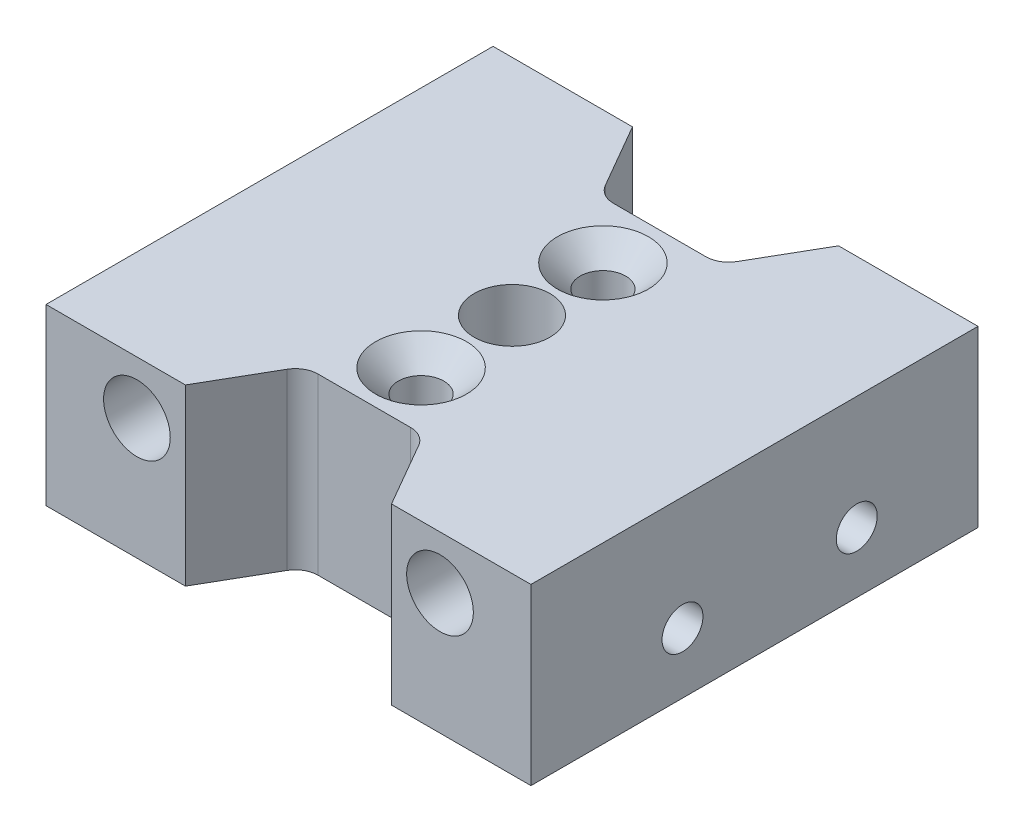
ISO-10303-21;
HEADER;
FILE_DESCRIPTION(('STEP AP214'),'2;1');
FILE_NAME('part.step','',(''),(''),'','','');
FILE_SCHEMA(('AUTOMOTIVE_DESIGN { 1 0 10303 214 1 1 1 1 }'));
ENDSEC;
DATA;
#1=APPLICATION_CONTEXT('core data for automotive mechanical design processes');
#2=APPLICATION_PROTOCOL_DEFINITION('international standard','automotive_design',2000,#1);
#3=PRODUCT_CONTEXT('',#1,'mechanical');
#4=PRODUCT('Part','Part','',(#3));
#5=PRODUCT_RELATED_PRODUCT_CATEGORY('part','',(#4));
#6=PRODUCT_DEFINITION_FORMATION('','',#4);
#7=PRODUCT_DEFINITION_CONTEXT('part definition',#1,'design');
#8=PRODUCT_DEFINITION('design','',#6,#7);
#9=PRODUCT_DEFINITION_SHAPE('','',#8);
#10=(LENGTH_UNIT() NAMED_UNIT(*) SI_UNIT(.MILLI.,.METRE.));
#11=(NAMED_UNIT(*) PLANE_ANGLE_UNIT() SI_UNIT($,.RADIAN.));
#12=(NAMED_UNIT(*) SI_UNIT($,.STERADIAN.) SOLID_ANGLE_UNIT());
#13=UNCERTAINTY_MEASURE_WITH_UNIT(LENGTH_MEASURE(1.E-05),#10,'distance_accuracy_value','');
#14=(GEOMETRIC_REPRESENTATION_CONTEXT(3) GLOBAL_UNCERTAINTY_ASSIGNED_CONTEXT((#13)) GLOBAL_UNIT_ASSIGNED_CONTEXT((#10,
#11,#12)) REPRESENTATION_CONTEXT('',''));
#15=CARTESIAN_POINT('',(0.,0.,0.));
#16=DIRECTION('',(0.,0.,1.));
#17=DIRECTION('',(1.,0.,0.));
#18=AXIS2_PLACEMENT_3D('',#15,#16,#17);
#19=CARTESIAN_POINT('',(0.,0.,29.5));
#20=DIRECTION('',(0.,0.,-1.));
#21=DIRECTION('',(-1.,0.,0.));
#22=AXIS2_PLACEMENT_3D('',#19,#20,#21);
#23=PLANE('',#22);
#24=CARTESIAN_POINT('',(8.00000000001407,-41.7399999999932,29.5));
#25=DIRECTION('',(0.,0.,1.));
#26=DIRECTION('',(1.,0.,0.));
#27=AXIS2_PLACEMENT_3D('',#24,#25,#26);
#28=CIRCLE('',#27,2.2);
#29=CARTESIAN_POINT('',(10.2000000000141,-41.7399999999932,29.5));
#30=VERTEX_POINT('',#29);
#31=EDGE_CURVE('E292',#30,#30,#28,.T.);
#32=ORIENTED_EDGE('',*,*,#31,.F.);
#33=EDGE_LOOP('',(#32));
#34=FACE_BOUND('',#33,.T.);
#35=DIRECTION('',(1.,0.,0.));
#36=VECTOR('',#35,1.);
#37=CARTESIAN_POINT('',(2.00000000001407,-49.7400000000227,29.5));
#38=LINE('',#37,#36);
#39=CARTESIAN_POINT('',(2.00000000001407,-49.7400000000227,29.5));
#40=VERTEX_POINT('',#39);
#41=CARTESIAN_POINT('',(11.2000000000141,-49.7400000000227,29.5));
#42=VERTEX_POINT('',#41);
#43=EDGE_CURVE('E303',#40,#42,#38,.T.);
#44=ORIENTED_EDGE('',*,*,#43,.T.);
#45=DIRECTION('',(0.,1.,0.));
#46=VECTOR('',#45,1.);
#47=CARTESIAN_POINT('',(11.2000000000141,-63.2399999999932,29.5));
#48=LINE('',#47,#46);
#49=CARTESIAN_POINT('',(11.2000000000141,-38.2399999999932,29.5));
#50=VERTEX_POINT('',#49);
#51=EDGE_CURVE('E214',#42,#50,#48,.T.);
#52=ORIENTED_EDGE('',*,*,#51,.T.);
#53=DIRECTION('',(-1.,0.,0.));
#54=VECTOR('',#53,1.);
#55=CARTESIAN_POINT('',(2.00000000001407,-38.2399999999932,29.5));
#56=LINE('',#55,#54);
#57=CARTESIAN_POINT('',(2.00000000001407,-38.2399999999932,29.5));
#58=VERTEX_POINT('',#57);
#59=EDGE_CURVE('E308',#50,#58,#56,.T.);
#60=ORIENTED_EDGE('',*,*,#59,.T.);
#61=DIRECTION('',(0.,-1.,0.));
#62=VECTOR('',#61,1.);
#63=CARTESIAN_POINT('',(2.00000000001407,-49.7400000000227,29.5));
#64=LINE('',#63,#62);
#65=EDGE_CURVE('E298',#58,#40,#64,.T.);
#66=ORIENTED_EDGE('',*,*,#65,.T.);
#67=EDGE_LOOP('',(#44,#52,#60,#66));
#68=FACE_BOUND('',#67,.T.);
#69=ADVANCED_FACE('F46',(#34,#68),#23,.F.);
#70=CARTESIAN_POINT('',(0.,0.,0.));
#71=DIRECTION('',(0.,0.,-1.));
#72=DIRECTION('',(-1.,0.,0.));
#73=AXIS2_PLACEMENT_3D('',#70,#71,#72);
#74=PLANE('',#73);
#75=DIRECTION('',(0.,1.,0.));
#76=VECTOR('',#75,1.);
#77=CARTESIAN_POINT('',(24.7999998897534,-63.2399999999932,0.));
#78=LINE('',#77,#76);
#79=CARTESIAN_POINT('',(24.7999998897534,-49.7400000000227,0.));
#80=VERTEX_POINT('',#79);
#81=CARTESIAN_POINT('',(24.7999998897534,-38.2399999999932,0.));
#82=VERTEX_POINT('',#81);
#83=EDGE_CURVE('E191',#80,#82,#78,.T.);
#84=ORIENTED_EDGE('',*,*,#83,.T.);
#85=DIRECTION('',(-1.,0.,0.));
#86=VECTOR('',#85,1.);
#87=CARTESIAN_POINT('',(2.00000000001407,-38.2399999999932,0.));
#88=LINE('',#87,#86);
#89=CARTESIAN_POINT('',(33.9999998897534,-38.2399999999932,0.));
#90=VERTEX_POINT('',#89);
#91=EDGE_CURVE('E302',#90,#82,#88,.T.);
#92=ORIENTED_EDGE('',*,*,#91,.F.);
#93=DIRECTION('',(0.,1.,0.));
#94=VECTOR('',#93,1.);
#95=CARTESIAN_POINT('',(33.9999998897534,-49.7400000000227,0.));
#96=LINE('',#95,#94);
#97=CARTESIAN_POINT('',(33.9999998897534,-49.7400000000227,0.));
#98=VERTEX_POINT('',#97);
#99=EDGE_CURVE('E319',#98,#90,#96,.T.);
#100=ORIENTED_EDGE('',*,*,#99,.F.);
#101=DIRECTION('',(1.,0.,0.));
#102=VECTOR('',#101,1.);
#103=CARTESIAN_POINT('',(2.00000000001407,-49.7400000000227,0.));
#104=LINE('',#103,#102);
#105=EDGE_CURVE('E315',#80,#98,#104,.T.);
#106=ORIENTED_EDGE('',*,*,#105,.F.);
#107=EDGE_LOOP('',(#84,#92,#100,#106));
#108=FACE_BOUND('',#107,.T.);
#109=CARTESIAN_POINT('',(27.9999998897534,-41.73789989831,0.));
#110=DIRECTION('',(0.,0.,1.));
#111=DIRECTION('',(1.,0.,0.));
#112=AXIS2_PLACEMENT_3D('',#109,#110,#111);
#113=CIRCLE('',#112,2.2);
#114=CARTESIAN_POINT('',(30.1999998897534,-41.73789989831,0.));
#115=VERTEX_POINT('',#114);
#116=EDGE_CURVE('E289',#115,#115,#113,.T.);
#117=ORIENTED_EDGE('',*,*,#116,.T.);
#118=EDGE_LOOP('',(#117));
#119=FACE_BOUND('',#118,.T.);
#120=ADVANCED_FACE('F376',(#108,#119),#74,.T.);
#121=CARTESIAN_POINT('',(33.9999998897534,-38.2399999999932,29.5));
#122=VERTEX_POINT('',#121);
#123=CARTESIAN_POINT('',(24.7999998897534,-38.2399999999932,29.5));
#124=VERTEX_POINT('',#123);
#125=EDGE_CURVE('E309',#122,#124,#56,.T.);
#126=ORIENTED_EDGE('',*,*,#125,.T.);
#127=DIRECTION('',(0.,1.,0.));
#128=VECTOR('',#127,1.);
#129=CARTESIAN_POINT('',(24.7999998897534,-63.2399999999932,29.5));
#130=LINE('',#129,#128);
#131=CARTESIAN_POINT('',(24.7999998897534,-49.7400000000227,29.5));
#132=VERTEX_POINT('',#131);
#133=EDGE_CURVE('E61',#132,#124,#130,.T.);
#134=ORIENTED_EDGE('',*,*,#133,.F.);
#135=CARTESIAN_POINT('',(33.9999998897534,-49.7400000000227,29.5));
#136=VERTEX_POINT('',#135);
#137=EDGE_CURVE('E301',#132,#136,#38,.T.);
#138=ORIENTED_EDGE('',*,*,#137,.T.);
#139=DIRECTION('',(0.,1.,0.));
#140=VECTOR('',#139,1.);
#141=CARTESIAN_POINT('',(33.9999998897534,-49.7400000000227,29.5));
#142=LINE('',#141,#140);
#143=EDGE_CURVE('E306',#136,#122,#142,.T.);
#144=ORIENTED_EDGE('',*,*,#143,.T.);
#145=EDGE_LOOP('',(#126,#134,#138,#144));
#146=FACE_BOUND('',#145,.T.);
#147=CARTESIAN_POINT('',(27.9999998897534,-41.73789989831,29.5));
#148=DIRECTION('',(0.,0.,1.));
#149=DIRECTION('',(1.,0.,0.));
#150=AXIS2_PLACEMENT_3D('',#147,#148,#149);
#151=CIRCLE('',#150,2.2);
#152=CARTESIAN_POINT('',(30.1999998897534,-41.73789989831,29.5));
#153=VERTEX_POINT('',#152);
#154=EDGE_CURVE('E285',#153,#153,#151,.T.);
#155=ORIENTED_EDGE('',*,*,#154,.F.);
#156=EDGE_LOOP('',(#155));
#157=FACE_BOUND('',#156,.T.);
#158=ADVANCED_FACE('F379',(#146,#157),#23,.F.);
#159=DIRECTION('',(0.,1.,0.));
#160=VECTOR('',#159,1.);
#161=CARTESIAN_POINT('',(11.2000000000141,-63.2399999999932,0.));
#162=LINE('',#161,#160);
#163=CARTESIAN_POINT('',(11.2000000000141,-49.7400000000227,0.));
#164=VERTEX_POINT('',#163);
#165=CARTESIAN_POINT('',(11.2000000000141,-38.2399999999932,0.));
#166=VERTEX_POINT('',#165);
#167=EDGE_CURVE('E69',#164,#166,#162,.T.);
#168=ORIENTED_EDGE('',*,*,#167,.F.);
#169=CARTESIAN_POINT('',(2.00000000001407,-49.7400000000227,0.));
#170=VERTEX_POINT('',#169);
#171=EDGE_CURVE('E316',#170,#164,#104,.T.);
#172=ORIENTED_EDGE('',*,*,#171,.F.);
#173=DIRECTION('',(0.,-1.,0.));
#174=VECTOR('',#173,1.);
#175=CARTESIAN_POINT('',(2.00000000001407,-49.7400000000227,0.));
#176=LINE('',#175,#174);
#177=CARTESIAN_POINT('',(2.00000000001407,-38.2399999999932,0.));
#178=VERTEX_POINT('',#177);
#179=EDGE_CURVE('E295',#178,#170,#176,.T.);
#180=ORIENTED_EDGE('',*,*,#179,.F.);
#181=EDGE_CURVE('E321',#166,#178,#88,.T.);
#182=ORIENTED_EDGE('',*,*,#181,.F.);
#183=EDGE_LOOP('',(#168,#172,#180,#182));
#184=FACE_BOUND('',#183,.T.);
#185=CARTESIAN_POINT('',(8.00000000001407,-41.7399999999932,0.));
#186=DIRECTION('',(0.,0.,1.));
#187=DIRECTION('',(1.,0.,0.));
#188=AXIS2_PLACEMENT_3D('',#185,#186,#187);
#189=CIRCLE('',#188,2.2);
#190=CARTESIAN_POINT('',(10.2000000000141,-41.7399999999932,0.));
#191=VERTEX_POINT('',#190);
#192=EDGE_CURVE('E288',#191,#191,#189,.T.);
#193=ORIENTED_EDGE('',*,*,#192,.T.);
#194=EDGE_LOOP('',(#193));
#195=FACE_BOUND('',#194,.T.);
#196=ADVANCED_FACE('F385',(#184,#195),#74,.T.);
#197=CARTESIAN_POINT('',(2.00000000001407,-49.7400000000227,29.5));
#198=DIRECTION('',(1.,0.,0.));
#199=DIRECTION('',(0.,1.,0.));
#200=AXIS2_PLACEMENT_3D('',#197,#198,#199);
#201=PLANE('',#200);
#202=CARTESIAN_POINT('',(2.00000000001407,-45.7400000000227,19.5));
#203=DIRECTION('',(1.,0.,0.));
#204=DIRECTION('',(0.,0.,-1.));
#205=AXIS2_PLACEMENT_3D('',#202,#203,#204);
#206=CIRCLE('',#205,1.35);
#207=CARTESIAN_POINT('',(2.00000000001407,-45.7400000000227,18.15));
#208=VERTEX_POINT('',#207);
#209=EDGE_CURVE('E256',#208,#208,#206,.T.);
#210=ORIENTED_EDGE('',*,*,#209,.T.);
#211=EDGE_LOOP('',(#210));
#212=FACE_BOUND('',#211,.T.);
#213=CARTESIAN_POINT('',(2.00000000001407,-45.7400000000227,8.));
#214=DIRECTION('',(1.,0.,0.));
#215=DIRECTION('',(0.,0.,-1.));
#216=AXIS2_PLACEMENT_3D('',#213,#214,#215);
#217=CIRCLE('',#216,1.35);
#218=CARTESIAN_POINT('',(2.00000000001407,-45.7400000000227,6.65));
#219=VERTEX_POINT('',#218);
#220=EDGE_CURVE('E251',#219,#219,#217,.T.);
#221=ORIENTED_EDGE('',*,*,#220,.T.);
#222=EDGE_LOOP('',(#221));
#223=FACE_BOUND('',#222,.T.);
#224=ORIENTED_EDGE('',*,*,#179,.T.);
#225=DIRECTION('',(0.,0.,-1.));
#226=VECTOR('',#225,1.);
#227=CARTESIAN_POINT('',(2.00000000001407,-49.7400000000227,29.5));
#228=LINE('',#227,#226);
#229=EDGE_CURVE('E331',#40,#170,#228,.T.);
#230=ORIENTED_EDGE('',*,*,#229,.F.);
#231=ORIENTED_EDGE('',*,*,#65,.F.);
#232=DIRECTION('',(0.,0.,-1.));
#233=VECTOR('',#232,1.);
#234=CARTESIAN_POINT('',(2.00000000001407,-38.2399999999932,29.5));
#235=LINE('',#234,#233);
#236=EDGE_CURVE('E312',#58,#178,#235,.T.);
#237=ORIENTED_EDGE('',*,*,#236,.T.);
#238=EDGE_LOOP('',(#224,#230,#231,#237));
#239=FACE_BOUND('',#238,.T.);
#240=ADVANCED_FACE('F394',(#212,#223,#239),#201,.F.);
#241=CARTESIAN_POINT('',(2.00000000001407,-49.7400000000227,29.5));
#242=DIRECTION('',(0.,1.,0.));
#243=DIRECTION('',(0.,0.,1.));
#244=AXIS2_PLACEMENT_3D('',#241,#242,#243);
#245=PLANE('',#244);
#246=CARTESIAN_POINT('',(17.9999999448837,-49.7400000000227,8.75));
#247=DIRECTION('',(0.,-1.,0.));
#248=DIRECTION('',(0.,0.,-1.));
#249=AXIS2_PLACEMENT_3D('',#246,#247,#248);
#250=CIRCLE('',#249,1.5);
#251=CARTESIAN_POINT('',(17.9999999448837,-49.7400000000227,7.25));
#252=VERTEX_POINT('',#251);
#253=EDGE_CURVE('E276',#252,#252,#250,.T.);
#254=ORIENTED_EDGE('',*,*,#253,.F.);
#255=EDGE_LOOP('',(#254));
#256=FACE_BOUND('',#255,.T.);
#257=CARTESIAN_POINT('',(17.9999999448837,-49.7400000000227,20.75));
#258=DIRECTION('',(0.,-1.,0.));
#259=DIRECTION('',(0.,0.,-1.));
#260=AXIS2_PLACEMENT_3D('',#257,#258,#259);
#261=CIRCLE('',#260,1.5);
#262=CARTESIAN_POINT('',(17.9999999448837,-49.7400000000227,19.25));
#263=VERTEX_POINT('',#262);
#264=EDGE_CURVE('E267',#263,#263,#261,.T.);
#265=ORIENTED_EDGE('',*,*,#264,.F.);
#266=EDGE_LOOP('',(#265));
#267=FACE_BOUND('',#266,.T.);
#268=CARTESIAN_POINT('',(17.9999999448837,-49.7400000000227,14.75));
#269=DIRECTION('',(0.,-1.,0.));
#270=DIRECTION('',(0.,0.,-1.));
#271=AXIS2_PLACEMENT_3D('',#268,#269,#270);
#272=CIRCLE('',#271,2.5);
#273=CARTESIAN_POINT('',(17.9999999448837,-49.7400000000227,12.25));
#274=VERTEX_POINT('',#273);
#275=EDGE_CURVE('E279',#274,#274,#272,.T.);
#276=ORIENTED_EDGE('',*,*,#275,.F.);
#277=EDGE_LOOP('',(#276));
#278=FACE_BOUND('',#277,.T.);
#279=CARTESIAN_POINT('',(21.0472231400208,-49.7400000000227,3.5));
#280=DIRECTION('',(0.,1.,0.));
#281=DIRECTION('',(0.,0.,1.));
#282=AXIS2_PLACEMENT_3D('',#279,#280,#281);
#283=CIRCLE('',#282,1.5);
#284=CARTESIAN_POINT('',(21.0472231400208,-49.7400000000227,5.));
#285=VERTEX_POINT('',#284);
#286=CARTESIAN_POINT('',(22.3462612456975,-49.7400000000227,4.25));
#287=VERTEX_POINT('',#286);
#288=EDGE_CURVE('E245',#285,#287,#283,.T.);
#289=ORIENTED_EDGE('',*,*,#288,.T.);
#290=DIRECTION('',(0.499999999999998,0.,-0.86602540378444));
#291=VECTOR('',#290,1.);
#292=CARTESIAN_POINT('',(6.32612521149817,-49.7400000000227,31.9976895553983));
#293=LINE('',#292,#291);
#294=EDGE_CURVE('E248',#287,#80,#293,.T.);
#295=ORIENTED_EDGE('',*,*,#294,.T.);
#296=ORIENTED_EDGE('',*,*,#105,.T.);
#297=DIRECTION('',(0.,0.,-1.));
#298=VECTOR('',#297,1.);
#299=CARTESIAN_POINT('',(33.9999998897534,-49.7400000000227,29.5));
#300=LINE('',#299,#298);
#301=EDGE_CURVE('E328',#136,#98,#300,.T.);
#302=ORIENTED_EDGE('',*,*,#301,.F.);
#303=ORIENTED_EDGE('',*,*,#137,.F.);
#304=DIRECTION('',(-0.499999999999998,0.,-0.86602540378444));
#305=VECTOR('',#304,1.);
#306=CARTESIAN_POINT('',(19.0999999173186,-49.7400000000227,19.6273104446017));
#307=LINE('',#306,#305);
#308=CARTESIAN_POINT('',(22.3462612456975,-49.7400000000227,25.25));
#309=VERTEX_POINT('',#308);
#310=EDGE_CURVE('E194',#132,#309,#307,.T.);
#311=ORIENTED_EDGE('',*,*,#310,.T.);
#312=CARTESIAN_POINT('',(21.0472231400208,-49.7400000000227,26.));
#313=DIRECTION('',(0.,1.,0.));
#314=DIRECTION('',(0.,0.,1.));
#315=AXIS2_PLACEMENT_3D('',#312,#313,#314);
#316=CIRCLE('',#315,1.5);
#317=CARTESIAN_POINT('',(21.0472231400208,-49.7400000000227,24.5));
#318=VERTEX_POINT('',#317);
#319=EDGE_CURVE('E227',#309,#318,#316,.T.);
#320=ORIENTED_EDGE('',*,*,#319,.T.);
#321=DIRECTION('',(-1.,0.,0.));
#322=VECTOR('',#321,1.);
#323=CARTESIAN_POINT('',(2.00000000001407,-49.7400000000227,24.5));
#324=LINE('',#323,#322);
#325=CARTESIAN_POINT('',(14.9527767497466,-49.7400000000227,24.5));
#326=VERTEX_POINT('',#325);
#327=EDGE_CURVE('E230',#318,#326,#324,.T.);
#328=ORIENTED_EDGE('',*,*,#327,.T.);
#329=CARTESIAN_POINT('',(14.9527767497466,-49.7400000000227,26.));
#330=DIRECTION('',(0.,1.,0.));
#331=DIRECTION('',(0.,0.,1.));
#332=AXIS2_PLACEMENT_3D('',#329,#330,#331);
#333=CIRCLE('',#332,1.5);
#334=CARTESIAN_POINT('',(13.65373864407,-49.7400000000227,25.25));
#335=VERTEX_POINT('',#334);
#336=EDGE_CURVE('E233',#326,#335,#333,.T.);
#337=ORIENTED_EDGE('',*,*,#336,.T.);
#338=DIRECTION('',(-0.499999999999999,0.,0.866025403784439));
#339=VECTOR('',#338,1.);
#340=CARTESIAN_POINT('',(8.90000000001408,-49.7400000000227,33.4837168574084));
#341=LINE('',#340,#339);
#342=EDGE_CURVE('E236',#335,#42,#341,.T.);
#343=ORIENTED_EDGE('',*,*,#342,.T.);
#344=ORIENTED_EDGE('',*,*,#43,.F.);
#345=ORIENTED_EDGE('',*,*,#229,.T.);
#346=ORIENTED_EDGE('',*,*,#171,.T.);
#347=DIRECTION('',(0.499999999999998,0.,0.86602540378444));
#348=VECTOR('',#347,1.);
#349=CARTESIAN_POINT('',(21.6738747058345,-49.7400000000227,18.1412831425917));
#350=LINE('',#349,#348);
#351=CARTESIAN_POINT('',(13.65373864407,-49.7400000000227,4.25));
#352=VERTEX_POINT('',#351);
#353=EDGE_CURVE('E239',#164,#352,#350,.T.);
#354=ORIENTED_EDGE('',*,*,#353,.T.);
#355=CARTESIAN_POINT('',(14.9527767497466,-49.7400000000227,3.5));
#356=DIRECTION('',(0.,1.,0.));
#357=DIRECTION('',(0.,0.,1.));
#358=AXIS2_PLACEMENT_3D('',#355,#356,#357);
#359=CIRCLE('',#358,1.5);
#360=CARTESIAN_POINT('',(14.9527767497466,-49.7400000000227,5.));
#361=VERTEX_POINT('',#360);
#362=EDGE_CURVE('E168',#352,#361,#359,.T.);
#363=ORIENTED_EDGE('',*,*,#362,.T.);
#364=DIRECTION('',(1.,0.,0.));
#365=VECTOR('',#364,1.);
#366=CARTESIAN_POINT('',(2.00000000001407,-49.7400000000227,5.));
#367=LINE('',#366,#365);
#368=EDGE_CURVE('E242',#361,#285,#367,.T.);
#369=ORIENTED_EDGE('',*,*,#368,.T.);
#370=EDGE_LOOP('',(#289,#295,#296,#302,#303,#311,#320,#328,#337,#343,#344,#345,#346,#354,#363,#369));
#371=FACE_BOUND('',#370,.T.);
#372=ADVANCED_FACE('F412',(#256,#267,#278,#371),#245,.F.);
#373=CARTESIAN_POINT('',(33.9999998897534,-49.7400000000227,29.5));
#374=DIRECTION('',(-1.,0.,0.));
#375=DIRECTION('',(0.,0.,1.));
#376=AXIS2_PLACEMENT_3D('',#373,#374,#375);
#377=PLANE('',#376);
#378=CARTESIAN_POINT('',(33.9999998897534,-45.7400000000227,19.5));
#379=DIRECTION('',(1.,0.,0.));
#380=DIRECTION('',(0.,0.,-1.));
#381=AXIS2_PLACEMENT_3D('',#378,#379,#380);
#382=CIRCLE('',#381,1.35);
#383=CARTESIAN_POINT('',(33.9999998897534,-45.7400000000227,18.15));
#384=VERTEX_POINT('',#383);
#385=EDGE_CURVE('E268',#384,#384,#382,.T.);
#386=ORIENTED_EDGE('',*,*,#385,.F.);
#387=EDGE_LOOP('',(#386));
#388=FACE_BOUND('',#387,.T.);
#389=CARTESIAN_POINT('',(33.9999998897534,-45.7400000000227,8.));
#390=DIRECTION('',(1.,0.,0.));
#391=DIRECTION('',(0.,0.,-1.));
#392=AXIS2_PLACEMENT_3D('',#389,#390,#391);
#393=CIRCLE('',#392,1.35);
#394=CARTESIAN_POINT('',(33.9999998897534,-45.7400000000227,6.65));
#395=VERTEX_POINT('',#394);
#396=EDGE_CURVE('E255',#395,#395,#393,.T.);
#397=ORIENTED_EDGE('',*,*,#396,.F.);
#398=EDGE_LOOP('',(#397));
#399=FACE_BOUND('',#398,.T.);
#400=ORIENTED_EDGE('',*,*,#99,.T.);
#401=DIRECTION('',(0.,0.,-1.));
#402=VECTOR('',#401,1.);
#403=CARTESIAN_POINT('',(33.9999998897534,-38.2399999999932,29.5));
#404=LINE('',#403,#402);
#405=EDGE_CURVE('E325',#122,#90,#404,.T.);
#406=ORIENTED_EDGE('',*,*,#405,.F.);
#407=ORIENTED_EDGE('',*,*,#143,.F.);
#408=ORIENTED_EDGE('',*,*,#301,.T.);
#409=EDGE_LOOP('',(#400,#406,#407,#408));
#410=FACE_BOUND('',#409,.T.);
#411=ADVANCED_FACE('F355',(#388,#399,#410),#377,.F.);
#412=CARTESIAN_POINT('',(2.00000000001407,-38.2399999999932,29.5));
#413=DIRECTION('',(0.,-1.,0.));
#414=DIRECTION('',(0.,0.,-1.));
#415=AXIS2_PLACEMENT_3D('',#412,#413,#414);
#416=PLANE('',#415);
#417=CARTESIAN_POINT('',(17.9999999448837,-38.2399999999932,8.75));
#418=DIRECTION('',(0.,-1.,0.));
#419=DIRECTION('',(0.,0.,-1.));
#420=AXIS2_PLACEMENT_3D('',#417,#418,#419);
#421=CIRCLE('',#420,3.);
#422=CARTESIAN_POINT('',(17.9999999448837,-38.2399999999932,5.75));
#423=VERTEX_POINT('',#422);
#424=EDGE_CURVE('E339',#423,#423,#421,.T.);
#425=ORIENTED_EDGE('',*,*,#424,.T.);
#426=EDGE_LOOP('',(#425));
#427=FACE_BOUND('',#426,.T.);
#428=CARTESIAN_POINT('',(17.9999999448837,-38.2399999999932,20.75));
#429=DIRECTION('',(0.,-1.,0.));
#430=DIRECTION('',(0.,0.,-1.));
#431=AXIS2_PLACEMENT_3D('',#428,#429,#430);
#432=CIRCLE('',#431,3.);
#433=CARTESIAN_POINT('',(17.9999999448837,-38.2399999999932,17.75));
#434=VERTEX_POINT('',#433);
#435=EDGE_CURVE('E334',#434,#434,#432,.T.);
#436=ORIENTED_EDGE('',*,*,#435,.T.);
#437=EDGE_LOOP('',(#436));
#438=FACE_BOUND('',#437,.T.);
#439=CARTESIAN_POINT('',(17.9999999448837,-38.2399999999932,14.75));
#440=DIRECTION('',(0.,-1.,0.));
#441=DIRECTION('',(0.,0.,-1.));
#442=AXIS2_PLACEMENT_3D('',#439,#440,#441);
#443=CIRCLE('',#442,2.5);
#444=CARTESIAN_POINT('',(17.9999999448837,-38.2399999999932,12.25));
#445=VERTEX_POINT('',#444);
#446=EDGE_CURVE('E284',#445,#445,#443,.T.);
#447=ORIENTED_EDGE('',*,*,#446,.T.);
#448=EDGE_LOOP('',(#447));
#449=FACE_BOUND('',#448,.T.);
#450=ORIENTED_EDGE('',*,*,#91,.T.);
#451=DIRECTION('',(0.499999999999998,0.,-0.86602540378444));
#452=VECTOR('',#451,1.);
#453=CARTESIAN_POINT('',(22.3462612456975,-38.2399999999932,4.25));
#454=LINE('',#453,#452);
#455=CARTESIAN_POINT('',(22.3462612456975,-38.2399999999932,4.25));
#456=VERTEX_POINT('',#455);
#457=EDGE_CURVE('E189',#456,#82,#454,.T.);
#458=ORIENTED_EDGE('',*,*,#457,.F.);
#459=CARTESIAN_POINT('',(21.0472231400208,-38.2399999999932,3.5));
#460=DIRECTION('',(0.,1.,0.));
#461=DIRECTION('',(0.,0.,1.));
#462=AXIS2_PLACEMENT_3D('',#459,#460,#461);
#463=CIRCLE('',#462,1.5);
#464=CARTESIAN_POINT('',(21.0472231400208,-38.2399999999932,5.));
#465=VERTEX_POINT('',#464);
#466=EDGE_CURVE('E184',#465,#456,#463,.T.);
#467=ORIENTED_EDGE('',*,*,#466,.F.);
#468=DIRECTION('',(1.,0.,0.));
#469=VECTOR('',#468,1.);
#470=CARTESIAN_POINT('',(14.9527767497466,-38.2399999999932,5.));
#471=LINE('',#470,#469);
#472=CARTESIAN_POINT('',(14.9527767497466,-38.2399999999932,5.));
#473=VERTEX_POINT('',#472);
#474=EDGE_CURVE('E182',#473,#465,#471,.T.);
#475=ORIENTED_EDGE('',*,*,#474,.F.);
#476=CARTESIAN_POINT('',(14.9527767497466,-38.2399999999932,3.5));
#477=DIRECTION('',(0.,1.,0.));
#478=DIRECTION('',(0.,0.,1.));
#479=AXIS2_PLACEMENT_3D('',#476,#477,#478);
#480=CIRCLE('',#479,1.5);
#481=CARTESIAN_POINT('',(13.65373864407,-38.2399999999932,4.25));
#482=VERTEX_POINT('',#481);
#483=EDGE_CURVE('E165',#482,#473,#480,.T.);
#484=ORIENTED_EDGE('',*,*,#483,.F.);
#485=DIRECTION('',(0.499999999999998,0.,0.86602540378444));
#486=VECTOR('',#485,1.);
#487=CARTESIAN_POINT('',(11.2000000000141,-38.2399999999932,0.));
#488=LINE('',#487,#486);
#489=EDGE_CURVE('E172',#166,#482,#488,.T.);
#490=ORIENTED_EDGE('',*,*,#489,.F.);
#491=ORIENTED_EDGE('',*,*,#181,.T.);
#492=ORIENTED_EDGE('',*,*,#236,.F.);
#493=ORIENTED_EDGE('',*,*,#59,.F.);
#494=DIRECTION('',(-0.499999999999999,0.,0.866025403784439));
#495=VECTOR('',#494,1.);
#496=CARTESIAN_POINT('',(11.2000000000141,-38.2399999999932,29.5));
#497=LINE('',#496,#495);
#498=CARTESIAN_POINT('',(13.65373864407,-38.2399999999932,25.25));
#499=VERTEX_POINT('',#498);
#500=EDGE_CURVE('E201',#499,#50,#497,.T.);
#501=ORIENTED_EDGE('',*,*,#500,.F.);
#502=CARTESIAN_POINT('',(14.9527767497466,-38.2399999999932,26.));
#503=DIRECTION('',(0.,1.,0.));
#504=DIRECTION('',(0.,0.,1.));
#505=AXIS2_PLACEMENT_3D('',#502,#503,#504);
#506=CIRCLE('',#505,1.5);
#507=CARTESIAN_POINT('',(14.9527767497466,-38.2399999999932,24.5));
#508=VERTEX_POINT('',#507);
#509=EDGE_CURVE('E211',#508,#499,#506,.T.);
#510=ORIENTED_EDGE('',*,*,#509,.F.);
#511=DIRECTION('',(-1.,0.,0.));
#512=VECTOR('',#511,1.);
#513=CARTESIAN_POINT('',(14.9527767497466,-38.2399999999932,24.5));
#514=LINE('',#513,#512);
#515=CARTESIAN_POINT('',(21.0472231400208,-38.2399999999932,24.5));
#516=VERTEX_POINT('',#515);
#517=EDGE_CURVE('E208',#516,#508,#514,.T.);
#518=ORIENTED_EDGE('',*,*,#517,.F.);
#519=CARTESIAN_POINT('',(21.0472231400208,-38.2399999999932,26.));
#520=DIRECTION('',(0.,1.,0.));
#521=DIRECTION('',(0.,0.,1.));
#522=AXIS2_PLACEMENT_3D('',#519,#520,#521);
#523=CIRCLE('',#522,1.5);
#524=CARTESIAN_POINT('',(22.3462612456975,-38.2399999999932,25.25));
#525=VERTEX_POINT('',#524);
#526=EDGE_CURVE('E205',#525,#516,#523,.T.);
#527=ORIENTED_EDGE('',*,*,#526,.F.);
#528=DIRECTION('',(-0.499999999999998,0.,-0.86602540378444));
#529=VECTOR('',#528,1.);
#530=CARTESIAN_POINT('',(22.3462612456975,-38.2399999999932,25.25));
#531=LINE('',#530,#529);
#532=EDGE_CURVE('E203',#124,#525,#531,.T.);
#533=ORIENTED_EDGE('',*,*,#532,.F.);
#534=ORIENTED_EDGE('',*,*,#125,.F.);
#535=ORIENTED_EDGE('',*,*,#405,.T.);
#536=EDGE_LOOP('',(#450,#458,#467,#475,#484,#490,#491,#492,#493,#501,#510,#518,#527,#533,#534,#535));
#537=FACE_BOUND('',#536,.T.);
#538=ADVANCED_FACE('F179',(#427,#438,#449,#537),#416,.F.);
#539=CARTESIAN_POINT('',(8.00000000001407,-41.7399999999932,29.5));
#540=DIRECTION('',(0.,0.,-1.));
#541=DIRECTION('',(-1.,0.,0.));
#542=AXIS2_PLACEMENT_3D('',#539,#540,#541);
#543=CYLINDRICAL_SURFACE('',#542,2.2);
#544=ORIENTED_EDGE('',*,*,#31,.T.);
#545=EDGE_LOOP('',(#544));
#546=FACE_BOUND('',#545,.T.);
#547=ORIENTED_EDGE('',*,*,#192,.F.);
#548=EDGE_LOOP('',(#547));
#549=FACE_BOUND('',#548,.T.);
#550=ADVANCED_FACE('F354',(#546,#549),#543,.F.);
#551=CARTESIAN_POINT('',(27.9999998897534,-41.73789989831,29.5));
#552=DIRECTION('',(0.,0.,-1.));
#553=DIRECTION('',(-1.,0.,0.));
#554=AXIS2_PLACEMENT_3D('',#551,#552,#553);
#555=CYLINDRICAL_SURFACE('',#554,2.2);
#556=ORIENTED_EDGE('',*,*,#154,.T.);
#557=EDGE_LOOP('',(#556));
#558=FACE_BOUND('',#557,.T.);
#559=ORIENTED_EDGE('',*,*,#116,.F.);
#560=EDGE_LOOP('',(#559));
#561=FACE_BOUND('',#560,.T.);
#562=ADVANCED_FACE('F364',(#558,#561),#555,.F.);
#563=CARTESIAN_POINT('',(17.9999999448837,-20.2400000000227,14.75));
#564=DIRECTION('',(0.,-1.,0.));
#565=DIRECTION('',(0.,0.,-1.));
#566=AXIS2_PLACEMENT_3D('',#563,#564,#565);
#567=CYLINDRICAL_SURFACE('',#566,2.5);
#568=ORIENTED_EDGE('',*,*,#275,.T.);
#569=EDGE_LOOP('',(#568));
#570=FACE_BOUND('',#569,.T.);
#571=ORIENTED_EDGE('',*,*,#446,.F.);
#572=EDGE_LOOP('',(#571));
#573=FACE_BOUND('',#572,.T.);
#574=ADVANCED_FACE('F361',(#570,#573),#567,.F.);
#575=CARTESIAN_POINT('',(17.9999999448837,-20.2400000000227,20.75));
#576=DIRECTION('',(0.,-1.,0.));
#577=DIRECTION('',(0.,0.,-1.));
#578=AXIS2_PLACEMENT_3D('',#575,#576,#577);
#579=CYLINDRICAL_SURFACE('',#578,1.5);
#580=CARTESIAN_POINT('',(17.9999999448837,-39.7399999999932,20.75));
#581=DIRECTION('',(0.,-1.,0.));
#582=DIRECTION('',(0.,0.,-1.));
#583=AXIS2_PLACEMENT_3D('',#580,#581,#582);
#584=CIRCLE('',#583,1.5);
#585=CARTESIAN_POINT('',(17.9999999448837,-39.7399999999932,19.25));
#586=VERTEX_POINT('',#585);
#587=EDGE_CURVE('E13',#586,#586,#584,.F.);
#588=ORIENTED_EDGE('',*,*,#587,.T.);
#589=EDGE_LOOP('',(#588));
#590=FACE_BOUND('',#589,.T.);
#591=ORIENTED_EDGE('',*,*,#264,.T.);
#592=EDGE_LOOP('',(#591));
#593=FACE_BOUND('',#592,.T.);
#594=ADVANCED_FACE('F363',(#590,#593),#579,.F.);
#595=CARTESIAN_POINT('',(17.9999999448837,-20.2400000000227,8.75));
#596=DIRECTION('',(0.,-1.,0.));
#597=DIRECTION('',(0.,0.,-1.));
#598=AXIS2_PLACEMENT_3D('',#595,#596,#597);
#599=CYLINDRICAL_SURFACE('',#598,1.5);
#600=CARTESIAN_POINT('',(17.9999999448837,-39.7399999999932,8.75));
#601=DIRECTION('',(0.,-1.,0.));
#602=DIRECTION('',(0.,0.,-1.));
#603=AXIS2_PLACEMENT_3D('',#600,#601,#602);
#604=CIRCLE('',#603,1.5);
#605=CARTESIAN_POINT('',(17.9999999448837,-39.7399999999932,7.25));
#606=VERTEX_POINT('',#605);
#607=EDGE_CURVE('E54',#606,#606,#604,.F.);
#608=ORIENTED_EDGE('',*,*,#607,.T.);
#609=EDGE_LOOP('',(#608));
#610=FACE_BOUND('',#609,.T.);
#611=ORIENTED_EDGE('',*,*,#253,.T.);
#612=EDGE_LOOP('',(#611));
#613=FACE_BOUND('',#612,.T.);
#614=ADVANCED_FACE('F344',(#610,#613),#599,.F.);
#615=CARTESIAN_POINT('',(17.9999999448837,-38.2399999999932,8.75));
#616=DIRECTION('',(0.,1.,0.));
#617=DIRECTION('',(0.,0.,1.));
#618=AXIS2_PLACEMENT_3D('',#615,#616,#617);
#619=CONICAL_SURFACE('',#618,3.,0.785398163397446);
#620=ORIENTED_EDGE('',*,*,#607,.F.);
#621=EDGE_LOOP('',(#620));
#622=FACE_BOUND('',#621,.T.);
#623=ORIENTED_EDGE('',*,*,#424,.F.);
#624=EDGE_LOOP('',(#623));
#625=FACE_BOUND('',#624,.T.);
#626=ADVANCED_FACE('F347',(#622,#625),#619,.F.);
#627=CARTESIAN_POINT('',(17.9999999448837,-38.2399999999932,20.75));
#628=DIRECTION('',(0.,1.,0.));
#629=DIRECTION('',(0.,0.,1.));
#630=AXIS2_PLACEMENT_3D('',#627,#628,#629);
#631=CONICAL_SURFACE('',#630,3.,0.785398163397445);
#632=ORIENTED_EDGE('',*,*,#587,.F.);
#633=EDGE_LOOP('',(#632));
#634=FACE_BOUND('',#633,.T.);
#635=ORIENTED_EDGE('',*,*,#435,.F.);
#636=EDGE_LOOP('',(#635));
#637=FACE_BOUND('',#636,.T.);
#638=ADVANCED_FACE('F48',(#634,#637),#631,.F.);
#639=CARTESIAN_POINT('',(23.9999998897534,-45.7400000000227,8.));
#640=DIRECTION('',(1.,0.,0.));
#641=DIRECTION('',(0.,0.,-1.));
#642=AXIS2_PLACEMENT_3D('',#639,#640,#641);
#643=CYLINDRICAL_SURFACE('',#642,1.35);
#644=CARTESIAN_POINT('',(23.9999998897534,-45.7400000000227,8.));
#645=DIRECTION('',(1.,0.,0.));
#646=DIRECTION('',(0.,0.,-1.));
#647=AXIS2_PLACEMENT_3D('',#644,#645,#646);
#648=CIRCLE('',#647,1.35);
#649=CARTESIAN_POINT('',(23.9999998897534,-45.7400000000227,6.65));
#650=VERTEX_POINT('',#649);
#651=EDGE_CURVE('E271',#650,#650,#648,.T.);
#652=ORIENTED_EDGE('',*,*,#651,.F.);
#653=EDGE_LOOP('',(#652));
#654=FACE_BOUND('',#653,.T.);
#655=ORIENTED_EDGE('',*,*,#396,.T.);
#656=EDGE_LOOP('',(#655));
#657=FACE_BOUND('',#656,.T.);
#658=ADVANCED_FACE('F484',(#654,#657),#643,.F.);
#659=CARTESIAN_POINT('',(23.9999998897534,-45.7400000000227,8.));
#660=DIRECTION('',(1.,0.,0.));
#661=DIRECTION('',(0.,0.,-1.));
#662=AXIS2_PLACEMENT_3D('',#659,#660,#661);
#663=PLANE('',#662);
#664=ORIENTED_EDGE('',*,*,#651,.T.);
#665=EDGE_LOOP('',(#664));
#666=FACE_BOUND('',#665,.T.);
#667=ADVANCED_FACE('F480',(#666),#663,.T.);
#668=CARTESIAN_POINT('',(23.9999998897534,-45.7400000000227,19.5));
#669=DIRECTION('',(1.,0.,0.));
#670=DIRECTION('',(0.,0.,-1.));
#671=AXIS2_PLACEMENT_3D('',#668,#669,#670);
#672=CYLINDRICAL_SURFACE('',#671,1.35);
#673=CARTESIAN_POINT('',(23.9999998897534,-45.7400000000227,19.5));
#674=DIRECTION('',(1.,0.,0.));
#675=DIRECTION('',(0.,0.,-1.));
#676=AXIS2_PLACEMENT_3D('',#673,#674,#675);
#677=CIRCLE('',#676,1.35);
#678=CARTESIAN_POINT('',(23.9999998897534,-45.7400000000227,18.15));
#679=VERTEX_POINT('',#678);
#680=EDGE_CURVE('E264',#679,#679,#677,.T.);
#681=ORIENTED_EDGE('',*,*,#680,.F.);
#682=EDGE_LOOP('',(#681));
#683=FACE_BOUND('',#682,.T.);
#684=ORIENTED_EDGE('',*,*,#385,.T.);
#685=EDGE_LOOP('',(#684));
#686=FACE_BOUND('',#685,.T.);
#687=ADVANCED_FACE('F476',(#683,#686),#672,.F.);
#688=CARTESIAN_POINT('',(23.9999998897534,-45.7400000000227,19.5));
#689=DIRECTION('',(1.,0.,0.));
#690=DIRECTION('',(0.,0.,-1.));
#691=AXIS2_PLACEMENT_3D('',#688,#689,#690);
#692=PLANE('',#691);
#693=ORIENTED_EDGE('',*,*,#680,.T.);
#694=EDGE_LOOP('',(#693));
#695=FACE_BOUND('',#694,.T.);
#696=ADVANCED_FACE('F472',(#695),#692,.T.);
#697=CARTESIAN_POINT('',(12.0000000000141,-45.7400000000227,8.));
#698=DIRECTION('',(-1.,0.,0.));
#699=DIRECTION('',(0.,-1.,0.));
#700=AXIS2_PLACEMENT_3D('',#697,#698,#699);
#701=CYLINDRICAL_SURFACE('',#700,1.35);
#702=CARTESIAN_POINT('',(12.0000000000141,-45.7400000000227,8.));
#703=DIRECTION('',(1.,0.,0.));
#704=DIRECTION('',(0.,0.,-1.));
#705=AXIS2_PLACEMENT_3D('',#702,#703,#704);
#706=CIRCLE('',#705,1.35);
#707=CARTESIAN_POINT('',(12.0000000000141,-45.7400000000227,6.65));
#708=VERTEX_POINT('',#707);
#709=EDGE_CURVE('E259',#708,#708,#706,.T.);
#710=ORIENTED_EDGE('',*,*,#709,.T.);
#711=EDGE_LOOP('',(#710));
#712=FACE_BOUND('',#711,.T.);
#713=ORIENTED_EDGE('',*,*,#220,.F.);
#714=EDGE_LOOP('',(#713));
#715=FACE_BOUND('',#714,.T.);
#716=ADVANCED_FACE('F468',(#712,#715),#701,.F.);
#717=CARTESIAN_POINT('',(12.0000000000141,-45.7400000000227,8.));
#718=DIRECTION('',(-1.,0.,0.));
#719=DIRECTION('',(0.,0.,-1.));
#720=AXIS2_PLACEMENT_3D('',#717,#718,#719);
#721=PLANE('',#720);
#722=ORIENTED_EDGE('',*,*,#709,.F.);
#723=EDGE_LOOP('',(#722));
#724=FACE_BOUND('',#723,.T.);
#725=ADVANCED_FACE('F464',(#724),#721,.T.);
#726=CARTESIAN_POINT('',(12.0000000000141,-45.7400000000227,19.5));
#727=DIRECTION('',(-1.,0.,0.));
#728=DIRECTION('',(0.,-1.,0.));
#729=AXIS2_PLACEMENT_3D('',#726,#727,#728);
#730=CYLINDRICAL_SURFACE('',#729,1.35);
#731=CARTESIAN_POINT('',(12.0000000000141,-45.7400000000227,19.5));
#732=DIRECTION('',(1.,0.,0.));
#733=DIRECTION('',(0.,0.,-1.));
#734=AXIS2_PLACEMENT_3D('',#731,#732,#733);
#735=CIRCLE('',#734,1.35);
#736=CARTESIAN_POINT('',(12.0000000000141,-45.7400000000227,18.15));
#737=VERTEX_POINT('',#736);
#738=EDGE_CURVE('E252',#737,#737,#735,.T.);
#739=ORIENTED_EDGE('',*,*,#738,.T.);
#740=EDGE_LOOP('',(#739));
#741=FACE_BOUND('',#740,.T.);
#742=ORIENTED_EDGE('',*,*,#209,.F.);
#743=EDGE_LOOP('',(#742));
#744=FACE_BOUND('',#743,.T.);
#745=ADVANCED_FACE('F460',(#741,#744),#730,.F.);
#746=CARTESIAN_POINT('',(12.0000000000141,-45.7400000000227,19.5));
#747=DIRECTION('',(-1.,0.,0.));
#748=DIRECTION('',(0.,0.,-1.));
#749=AXIS2_PLACEMENT_3D('',#746,#747,#748);
#750=PLANE('',#749);
#751=ORIENTED_EDGE('',*,*,#738,.F.);
#752=EDGE_LOOP('',(#751));
#753=FACE_BOUND('',#752,.T.);
#754=ADVANCED_FACE('F457',(#753),#750,.T.);
#755=CARTESIAN_POINT('',(11.2000000000141,-63.2399999999932,29.5));
#756=DIRECTION('',(-0.866025403784439,0.,-0.499999999999999));
#757=DIRECTION('',(-0.499999999999999,0.,0.866025403784439));
#758=AXIS2_PLACEMENT_3D('',#755,#756,#757);
#759=PLANE('',#758);
#760=DIRECTION('',(0.,1.,0.));
#761=VECTOR('',#760,1.);
#762=CARTESIAN_POINT('',(13.65373864407,-63.2399999999932,25.25));
#763=LINE('',#762,#761);
#764=EDGE_CURVE('E176',#335,#499,#763,.T.);
#765=ORIENTED_EDGE('',*,*,#764,.T.);
#766=ORIENTED_EDGE('',*,*,#500,.T.);
#767=ORIENTED_EDGE('',*,*,#51,.F.);
#768=ORIENTED_EDGE('',*,*,#342,.F.);
#769=EDGE_LOOP('',(#765,#766,#767,#768));
#770=FACE_BOUND('',#769,.T.);
#771=ADVANCED_FACE('F436',(#770),#759,.F.);
#772=CARTESIAN_POINT('',(14.9527767497466,-63.2399999999932,26.));
#773=DIRECTION('',(0.,1.,0.));
#774=DIRECTION('',(0.,0.,1.));
#775=AXIS2_PLACEMENT_3D('',#772,#773,#774);
#776=CYLINDRICAL_SURFACE('',#775,1.5);
#777=DIRECTION('',(0.,1.,0.));
#778=VECTOR('',#777,1.);
#779=CARTESIAN_POINT('',(14.9527767497466,-63.2399999999932,24.5));
#780=LINE('',#779,#778);
#781=EDGE_CURVE('E216',#326,#508,#780,.T.);
#782=ORIENTED_EDGE('',*,*,#781,.T.);
#783=ORIENTED_EDGE('',*,*,#509,.T.);
#784=ORIENTED_EDGE('',*,*,#764,.F.);
#785=ORIENTED_EDGE('',*,*,#336,.F.);
#786=EDGE_LOOP('',(#782,#783,#784,#785));
#787=FACE_BOUND('',#786,.T.);
#788=ADVANCED_FACE('F439',(#787),#776,.F.);
#789=CARTESIAN_POINT('',(14.9527767497466,-63.2399999999932,24.5));
#790=DIRECTION('',(0.,0.,-1.));
#791=DIRECTION('',(-1.,0.,0.));
#792=AXIS2_PLACEMENT_3D('',#789,#790,#791);
#793=PLANE('',#792);
#794=DIRECTION('',(0.,1.,0.));
#795=VECTOR('',#794,1.);
#796=CARTESIAN_POINT('',(21.0472231400208,-63.2399999999932,24.5));
#797=LINE('',#796,#795);
#798=EDGE_CURVE('E218',#318,#516,#797,.T.);
#799=ORIENTED_EDGE('',*,*,#798,.T.);
#800=ORIENTED_EDGE('',*,*,#517,.T.);
#801=ORIENTED_EDGE('',*,*,#781,.F.);
#802=ORIENTED_EDGE('',*,*,#327,.F.);
#803=EDGE_LOOP('',(#799,#800,#801,#802));
#804=FACE_BOUND('',#803,.T.);
#805=ADVANCED_FACE('F442',(#804),#793,.F.);
#806=CARTESIAN_POINT('',(21.0472231400208,-63.2399999999932,26.));
#807=DIRECTION('',(0.,1.,0.));
#808=DIRECTION('',(0.,0.,1.));
#809=AXIS2_PLACEMENT_3D('',#806,#807,#808);
#810=CYLINDRICAL_SURFACE('',#809,1.5);
#811=DIRECTION('',(0.,1.,0.));
#812=VECTOR('',#811,1.);
#813=CARTESIAN_POINT('',(22.3462612456975,-63.2399999999932,25.25));
#814=LINE('',#813,#812);
#815=EDGE_CURVE('E220',#309,#525,#814,.T.);
#816=ORIENTED_EDGE('',*,*,#815,.T.);
#817=ORIENTED_EDGE('',*,*,#526,.T.);
#818=ORIENTED_EDGE('',*,*,#798,.F.);
#819=ORIENTED_EDGE('',*,*,#319,.F.);
#820=EDGE_LOOP('',(#816,#817,#818,#819));
#821=FACE_BOUND('',#820,.T.);
#822=ADVANCED_FACE('F444',(#821),#810,.F.);
#823=CARTESIAN_POINT('',(22.3462612456975,-63.2399999999932,25.25));
#824=DIRECTION('',(0.86602540378444,0.,-0.499999999999998));
#825=DIRECTION('',(-0.499999999999998,0.,-0.86602540378444));
#826=AXIS2_PLACEMENT_3D('',#823,#824,#825);
#827=PLANE('',#826);
#828=ORIENTED_EDGE('',*,*,#133,.T.);
#829=ORIENTED_EDGE('',*,*,#532,.T.);
#830=ORIENTED_EDGE('',*,*,#815,.F.);
#831=ORIENTED_EDGE('',*,*,#310,.F.);
#832=EDGE_LOOP('',(#828,#829,#830,#831));
#833=FACE_BOUND('',#832,.T.);
#834=ADVANCED_FACE('F409',(#833),#827,.F.);
#835=CARTESIAN_POINT('',(22.3462612456975,-63.2399999999932,4.25));
#836=DIRECTION('',(0.86602540378444,0.,0.499999999999998));
#837=DIRECTION('',(0.499999999999998,0.,-0.86602540378444));
#838=AXIS2_PLACEMENT_3D('',#835,#836,#837);
#839=PLANE('',#838);
#840=DIRECTION('',(0.,1.,0.));
#841=VECTOR('',#840,1.);
#842=CARTESIAN_POINT('',(22.3462612456975,-63.2399999999932,4.25));
#843=LINE('',#842,#841);
#844=EDGE_CURVE('E195',#287,#456,#843,.T.);
#845=ORIENTED_EDGE('',*,*,#844,.T.);
#846=ORIENTED_EDGE('',*,*,#457,.T.);
#847=ORIENTED_EDGE('',*,*,#83,.F.);
#848=ORIENTED_EDGE('',*,*,#294,.F.);
#849=EDGE_LOOP('',(#845,#846,#847,#848));
#850=FACE_BOUND('',#849,.T.);
#851=ADVANCED_FACE('F419',(#850),#839,.F.);
#852=CARTESIAN_POINT('',(21.0472231400208,-63.2399999999932,3.5));
#853=DIRECTION('',(0.,1.,0.));
#854=DIRECTION('',(0.,0.,1.));
#855=AXIS2_PLACEMENT_3D('',#852,#853,#854);
#856=CYLINDRICAL_SURFACE('',#855,1.5);
#857=DIRECTION('',(0.,1.,0.));
#858=VECTOR('',#857,1.);
#859=CARTESIAN_POINT('',(21.0472231400208,-63.2399999999932,5.));
#860=LINE('',#859,#858);
#861=EDGE_CURVE('E197',#285,#465,#860,.T.);
#862=ORIENTED_EDGE('',*,*,#861,.T.);
#863=ORIENTED_EDGE('',*,*,#466,.T.);
#864=ORIENTED_EDGE('',*,*,#844,.F.);
#865=ORIENTED_EDGE('',*,*,#288,.F.);
#866=EDGE_LOOP('',(#862,#863,#864,#865));
#867=FACE_BOUND('',#866,.T.);
#868=ADVANCED_FACE('F422',(#867),#856,.F.);
#869=CARTESIAN_POINT('',(14.9527767497466,-63.2399999999932,5.));
#870=DIRECTION('',(0.,0.,1.));
#871=DIRECTION('',(1.,0.,0.));
#872=AXIS2_PLACEMENT_3D('',#869,#870,#871);
#873=PLANE('',#872);
#874=DIRECTION('',(0.,1.,0.));
#875=VECTOR('',#874,1.);
#876=CARTESIAN_POINT('',(14.9527767497466,-63.2399999999932,5.));
#877=LINE('',#876,#875);
#878=EDGE_CURVE('E170',#361,#473,#877,.T.);
#879=ORIENTED_EDGE('',*,*,#878,.T.);
#880=ORIENTED_EDGE('',*,*,#474,.T.);
#881=ORIENTED_EDGE('',*,*,#861,.F.);
#882=ORIENTED_EDGE('',*,*,#368,.F.);
#883=EDGE_LOOP('',(#879,#880,#881,#882));
#884=FACE_BOUND('',#883,.T.);
#885=ADVANCED_FACE('F425',(#884),#873,.F.);
#886=CARTESIAN_POINT('',(14.9527767497466,-63.2399999999932,3.5));
#887=DIRECTION('',(0.,1.,0.));
#888=DIRECTION('',(0.,0.,1.));
#889=AXIS2_PLACEMENT_3D('',#886,#887,#888);
#890=CYLINDRICAL_SURFACE('',#889,1.5);
#891=DIRECTION('',(0.,1.,0.));
#892=VECTOR('',#891,1.);
#893=CARTESIAN_POINT('',(13.65373864407,-63.2399999999932,4.25));
#894=LINE('',#893,#892);
#895=EDGE_CURVE('E161',#352,#482,#894,.T.);
#896=ORIENTED_EDGE('',*,*,#895,.T.);
#897=ORIENTED_EDGE('',*,*,#483,.T.);
#898=ORIENTED_EDGE('',*,*,#878,.F.);
#899=ORIENTED_EDGE('',*,*,#362,.F.);
#900=EDGE_LOOP('',(#896,#897,#898,#899));
#901=FACE_BOUND('',#900,.T.);
#902=ADVANCED_FACE('F162',(#901),#890,.F.);
#903=CARTESIAN_POINT('',(11.2000000000141,-63.2399999999932,0.));
#904=DIRECTION('',(-0.86602540378444,0.,0.499999999999998));
#905=DIRECTION('',(0.499999999999998,0.,0.86602540378444));
#906=AXIS2_PLACEMENT_3D('',#903,#904,#905);
#907=PLANE('',#906);
#908=ORIENTED_EDGE('',*,*,#167,.T.);
#909=ORIENTED_EDGE('',*,*,#489,.T.);
#910=ORIENTED_EDGE('',*,*,#895,.F.);
#911=ORIENTED_EDGE('',*,*,#353,.F.);
#912=EDGE_LOOP('',(#908,#909,#910,#911));
#913=FACE_BOUND('',#912,.T.);
#914=ADVANCED_FACE('F173',(#913),#907,.F.);
#915=CLOSED_SHELL('',(#69,#120,#158,#196,#240,#372,#411,#538,#550,#562,#574,#594,#614,#626,#638,
#658,#667,#687,#696,#716,#725,#745,#754,#771,#788,#805,#822,#834,#851,#868,#885,#902,#914));
#916=MANIFOLD_SOLID_BREP('B2',#915);
#917=ADVANCED_BREP_SHAPE_REPRESENTATION('',(#18,#916),#14);
#918=SHAPE_DEFINITION_REPRESENTATION(#9,#917);
ENDSEC;
END-ISO-10303-21;
